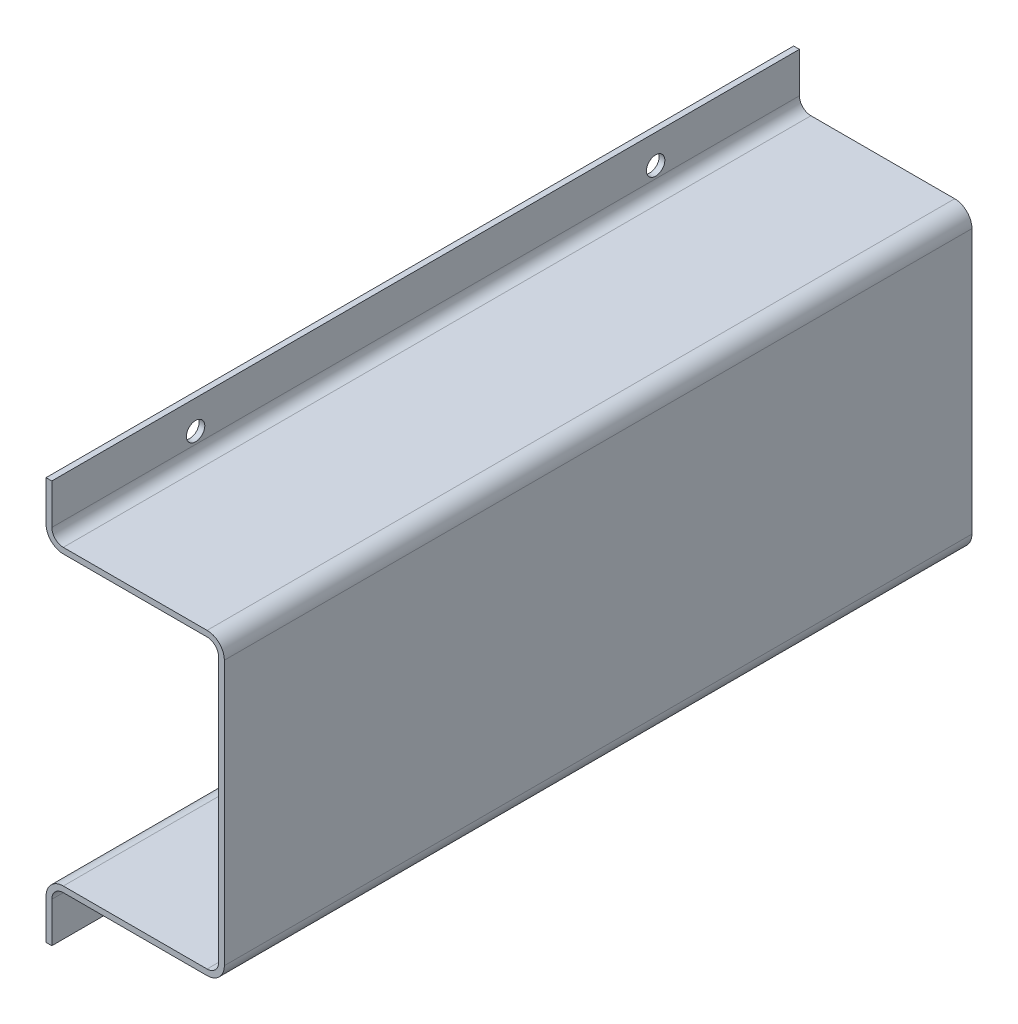
ISO-10303-21;
HEADER;
FILE_DESCRIPTION(('STEP AP214'),'2;1');
FILE_NAME('part.step','',(''),(''),'','','');
FILE_SCHEMA(('AUTOMOTIVE_DESIGN { 1 0 10303 214 1 1 1 1 }'));
ENDSEC;
DATA;
#1=APPLICATION_CONTEXT('core data for automotive mechanical design processes');
#2=APPLICATION_PROTOCOL_DEFINITION('international standard','automotive_design',2000,#1);
#3=PRODUCT_CONTEXT('',#1,'mechanical');
#4=PRODUCT('Part','Part','',(#3));
#5=PRODUCT_RELATED_PRODUCT_CATEGORY('part','',(#4));
#6=PRODUCT_DEFINITION_FORMATION('','',#4);
#7=PRODUCT_DEFINITION_CONTEXT('part definition',#1,'design');
#8=PRODUCT_DEFINITION('design','',#6,#7);
#9=PRODUCT_DEFINITION_SHAPE('','',#8);
#10=(LENGTH_UNIT() NAMED_UNIT(*) SI_UNIT(.MILLI.,.METRE.));
#11=(NAMED_UNIT(*) PLANE_ANGLE_UNIT() SI_UNIT($,.RADIAN.));
#12=(NAMED_UNIT(*) SI_UNIT($,.STERADIAN.) SOLID_ANGLE_UNIT());
#13=UNCERTAINTY_MEASURE_WITH_UNIT(LENGTH_MEASURE(1.E-05),#10,'distance_accuracy_value','');
#14=(GEOMETRIC_REPRESENTATION_CONTEXT(3) GLOBAL_UNCERTAINTY_ASSIGNED_CONTEXT((#13)) GLOBAL_UNIT_ASSIGNED_CONTEXT((#10,
#11,#12)) REPRESENTATION_CONTEXT('',''));
#15=CARTESIAN_POINT('',(0.,0.,0.));
#16=DIRECTION('',(0.,0.,1.));
#17=DIRECTION('',(1.,0.,0.));
#18=AXIS2_PLACEMENT_3D('',#15,#16,#17);
#19=CARTESIAN_POINT('',(0.,35.,130.));
#20=DIRECTION('',(0.,-1.,0.));
#21=DIRECTION('',(0.,0.,-1.));
#22=AXIS2_PLACEMENT_3D('',#19,#20,#21);
#23=PLANE('',#22);
#24=DIRECTION('',(-1.,0.,0.));
#25=VECTOR('',#24,1.);
#26=CARTESIAN_POINT('',(0.,35.,0.));
#27=LINE('',#26,#25);
#28=CARTESIAN_POINT('',(0.999999999999999,35.,0.));
#29=VERTEX_POINT('',#28);
#30=CARTESIAN_POINT('',(0.,35.,0.));
#31=VERTEX_POINT('',#30);
#32=EDGE_CURVE('E147',#29,#31,#27,.T.);
#33=ORIENTED_EDGE('',*,*,#32,.T.);
#34=DIRECTION('',(0.,0.,-1.));
#35=VECTOR('',#34,1.);
#36=CARTESIAN_POINT('',(0.,35.,130.));
#37=LINE('',#36,#35);
#38=CARTESIAN_POINT('',(0.,35.,130.));
#39=VERTEX_POINT('',#38);
#40=EDGE_CURVE('E11',#39,#31,#37,.T.);
#41=ORIENTED_EDGE('',*,*,#40,.F.);
#42=DIRECTION('',(-1.,0.,0.));
#43=VECTOR('',#42,1.);
#44=CARTESIAN_POINT('',(0.,35.,130.));
#45=LINE('',#44,#43);
#46=CARTESIAN_POINT('',(0.999999999999999,35.,130.));
#47=VERTEX_POINT('',#46);
#48=EDGE_CURVE('E169',#47,#39,#45,.T.);
#49=ORIENTED_EDGE('',*,*,#48,.F.);
#50=DIRECTION('',(0.,0.,-1.));
#51=VECTOR('',#50,1.);
#52=CARTESIAN_POINT('',(0.999999999999999,35.,130.));
#53=LINE('',#52,#51);
#54=EDGE_CURVE('E143',#47,#29,#53,.T.);
#55=ORIENTED_EDGE('',*,*,#54,.T.);
#56=EDGE_LOOP('',(#33,#41,#49,#55));
#57=FACE_BOUND('',#56,.T.);
#58=ADVANCED_FACE('F34',(#57),#23,.F.);
#59=CARTESIAN_POINT('',(0.,35.,130.));
#60=DIRECTION('',(1.,0.,0.));
#61=DIRECTION('',(0.,1.,0.));
#62=AXIS2_PLACEMENT_3D('',#59,#60,#61);
#63=PLANE('',#62);
#64=CARTESIAN_POINT('',(0.,30.,25.));
#65=DIRECTION('',(1.,0.,0.));
#66=DIRECTION('',(0.,1.,0.));
#67=AXIS2_PLACEMENT_3D('',#64,#65,#66);
#68=CIRCLE('',#67,1.59999999999999);
#69=CARTESIAN_POINT('',(0.,31.6,25.));
#70=VERTEX_POINT('',#69);
#71=EDGE_CURVE('E553',#70,#70,#68,.T.);
#72=ORIENTED_EDGE('',*,*,#71,.T.);
#73=EDGE_LOOP('',(#72));
#74=FACE_BOUND('',#73,.T.);
#75=CARTESIAN_POINT('',(0.,30.,105.));
#76=DIRECTION('',(1.,0.,0.));
#77=DIRECTION('',(0.,1.,0.));
#78=AXIS2_PLACEMENT_3D('',#75,#76,#77);
#79=CIRCLE('',#78,1.59999999999999);
#80=CARTESIAN_POINT('',(0.,31.6,105.));
#81=VERTEX_POINT('',#80);
#82=EDGE_CURVE('E151',#81,#81,#79,.T.);
#83=ORIENTED_EDGE('',*,*,#82,.T.);
#84=EDGE_LOOP('',(#83));
#85=FACE_BOUND('',#84,.T.);
#86=DIRECTION('',(0.,-1.,0.));
#87=VECTOR('',#86,1.);
#88=CARTESIAN_POINT('',(0.,35.,0.));
#89=LINE('',#88,#87);
#90=CARTESIAN_POINT('',(0.,28.,0.));
#91=VERTEX_POINT('',#90);
#92=EDGE_CURVE('E150',#31,#91,#89,.T.);
#93=ORIENTED_EDGE('',*,*,#92,.T.);
#94=DIRECTION('',(0.,0.,-1.));
#95=VECTOR('',#94,1.);
#96=CARTESIAN_POINT('',(0.,28.,130.));
#97=LINE('',#96,#95);
#98=CARTESIAN_POINT('',(0.,28.,130.));
#99=VERTEX_POINT('',#98);
#100=EDGE_CURVE('E43',#99,#91,#97,.T.);
#101=ORIENTED_EDGE('',*,*,#100,.F.);
#102=DIRECTION('',(0.,-1.,0.));
#103=VECTOR('',#102,1.);
#104=CARTESIAN_POINT('',(0.,35.,130.));
#105=LINE('',#104,#103);
#106=EDGE_CURVE('E101',#39,#99,#105,.T.);
#107=ORIENTED_EDGE('',*,*,#106,.F.);
#108=ORIENTED_EDGE('',*,*,#40,.T.);
#109=EDGE_LOOP('',(#93,#101,#107,#108));
#110=FACE_BOUND('',#109,.T.);
#111=ADVANCED_FACE('F249',(#74,#85,#110),#63,.F.);
#112=CARTESIAN_POINT('',(3.,28.,130.));
#113=DIRECTION('',(0.,0.,-1.));
#114=DIRECTION('',(-1.,0.,0.));
#115=AXIS2_PLACEMENT_3D('',#112,#113,#114);
#116=CYLINDRICAL_SURFACE('',#115,3.);
#117=CARTESIAN_POINT('',(3.,28.,0.));
#118=DIRECTION('',(0.,0.,1.));
#119=DIRECTION('',(1.,0.,0.));
#120=AXIS2_PLACEMENT_3D('',#117,#118,#119);
#121=CIRCLE('',#120,3.);
#122=CARTESIAN_POINT('',(3.,25.,0.));
#123=VERTEX_POINT('',#122);
#124=EDGE_CURVE('E153',#91,#123,#121,.T.);
#125=ORIENTED_EDGE('',*,*,#124,.T.);
#126=DIRECTION('',(0.,0.,-1.));
#127=VECTOR('',#126,1.);
#128=CARTESIAN_POINT('',(3.,25.,130.));
#129=LINE('',#128,#127);
#130=CARTESIAN_POINT('',(3.,25.,130.));
#131=VERTEX_POINT('',#130);
#132=EDGE_CURVE('E182',#131,#123,#129,.T.);
#133=ORIENTED_EDGE('',*,*,#132,.F.);
#134=CARTESIAN_POINT('',(3.,28.,130.));
#135=DIRECTION('',(0.,0.,1.));
#136=DIRECTION('',(1.,0.,0.));
#137=AXIS2_PLACEMENT_3D('',#134,#135,#136);
#138=CIRCLE('',#137,3.);
#139=EDGE_CURVE('E191',#99,#131,#138,.T.);
#140=ORIENTED_EDGE('',*,*,#139,.F.);
#141=ORIENTED_EDGE('',*,*,#100,.T.);
#142=EDGE_LOOP('',(#125,#133,#140,#141));
#143=FACE_BOUND('',#142,.T.);
#144=ADVANCED_FACE('F189',(#143),#116,.T.);
#145=CARTESIAN_POINT('',(3.,25.,130.));
#146=DIRECTION('',(0.,1.,0.));
#147=DIRECTION('',(0.,0.,1.));
#148=AXIS2_PLACEMENT_3D('',#145,#146,#147);
#149=PLANE('',#148);
#150=DIRECTION('',(1.,0.,0.));
#151=VECTOR('',#150,1.);
#152=CARTESIAN_POINT('',(3.,25.,0.));
#153=LINE('',#152,#151);
#154=CARTESIAN_POINT('',(28.,25.,0.));
#155=VERTEX_POINT('',#154);
#156=EDGE_CURVE('E155',#123,#155,#153,.T.);
#157=ORIENTED_EDGE('',*,*,#156,.T.);
#158=DIRECTION('',(0.,0.,-1.));
#159=VECTOR('',#158,1.);
#160=CARTESIAN_POINT('',(28.,25.,130.));
#161=LINE('',#160,#159);
#162=CARTESIAN_POINT('',(28.,25.,130.));
#163=VERTEX_POINT('',#162);
#164=EDGE_CURVE('E179',#163,#155,#161,.T.);
#165=ORIENTED_EDGE('',*,*,#164,.F.);
#166=DIRECTION('',(1.,0.,0.));
#167=VECTOR('',#166,1.);
#168=CARTESIAN_POINT('',(3.,25.,130.));
#169=LINE('',#168,#167);
#170=EDGE_CURVE('E210',#131,#163,#169,.T.);
#171=ORIENTED_EDGE('',*,*,#170,.F.);
#172=ORIENTED_EDGE('',*,*,#132,.T.);
#173=EDGE_LOOP('',(#157,#165,#171,#172));
#174=FACE_BOUND('',#173,.T.);
#175=ADVANCED_FACE('F200',(#174),#149,.F.);
#176=CARTESIAN_POINT('',(28.,23.,130.));
#177=DIRECTION('',(0.,0.,-1.));
#178=DIRECTION('',(-1.,0.,0.));
#179=AXIS2_PLACEMENT_3D('',#176,#177,#178);
#180=CYLINDRICAL_SURFACE('',#179,2.00000000000001);
#181=CARTESIAN_POINT('',(28.,23.,0.));
#182=DIRECTION('',(0.,0.,-1.));
#183=DIRECTION('',(-1.,0.,0.));
#184=AXIS2_PLACEMENT_3D('',#181,#182,#183);
#185=CIRCLE('',#184,2.00000000000001);
#186=CARTESIAN_POINT('',(30.,23.,0.));
#187=VERTEX_POINT('',#186);
#188=EDGE_CURVE('E157',#155,#187,#185,.T.);
#189=ORIENTED_EDGE('',*,*,#188,.T.);
#190=DIRECTION('',(0.,0.,-1.));
#191=VECTOR('',#190,1.);
#192=CARTESIAN_POINT('',(30.,23.,130.));
#193=LINE('',#192,#191);
#194=CARTESIAN_POINT('',(30.,23.,130.));
#195=VERTEX_POINT('',#194);
#196=EDGE_CURVE('E176',#195,#187,#193,.T.);
#197=ORIENTED_EDGE('',*,*,#196,.F.);
#198=CARTESIAN_POINT('',(28.,23.,130.));
#199=DIRECTION('',(0.,0.,-1.));
#200=DIRECTION('',(-1.,0.,0.));
#201=AXIS2_PLACEMENT_3D('',#198,#199,#200);
#202=CIRCLE('',#201,2.00000000000001);
#203=EDGE_CURVE('E206',#163,#195,#202,.T.);
#204=ORIENTED_EDGE('',*,*,#203,.F.);
#205=ORIENTED_EDGE('',*,*,#164,.T.);
#206=EDGE_LOOP('',(#189,#197,#204,#205));
#207=FACE_BOUND('',#206,.T.);
#208=ADVANCED_FACE('F204',(#207),#180,.F.);
#209=CARTESIAN_POINT('',(30.,23.,130.));
#210=DIRECTION('',(1.,0.,0.));
#211=DIRECTION('',(0.,1.,0.));
#212=AXIS2_PLACEMENT_3D('',#209,#210,#211);
#213=PLANE('',#212);
#214=DIRECTION('',(0.,-1.,0.));
#215=VECTOR('',#214,1.);
#216=CARTESIAN_POINT('',(30.,23.,0.));
#217=LINE('',#216,#215);
#218=CARTESIAN_POINT('',(30.,-23.,0.));
#219=VERTEX_POINT('',#218);
#220=EDGE_CURVE('E159',#187,#219,#217,.T.);
#221=ORIENTED_EDGE('',*,*,#220,.T.);
#222=DIRECTION('',(0.,0.,-1.));
#223=VECTOR('',#222,1.);
#224=CARTESIAN_POINT('',(30.,-23.,130.));
#225=LINE('',#224,#223);
#226=CARTESIAN_POINT('',(30.,-23.,130.));
#227=VERTEX_POINT('',#226);
#228=EDGE_CURVE('E533',#227,#219,#225,.T.);
#229=ORIENTED_EDGE('',*,*,#228,.F.);
#230=DIRECTION('',(0.,-1.,0.));
#231=VECTOR('',#230,1.);
#232=CARTESIAN_POINT('',(30.,23.,130.));
#233=LINE('',#232,#231);
#234=EDGE_CURVE('E209',#195,#227,#233,.T.);
#235=ORIENTED_EDGE('',*,*,#234,.F.);
#236=ORIENTED_EDGE('',*,*,#196,.T.);
#237=EDGE_LOOP('',(#221,#229,#235,#236));
#238=FACE_BOUND('',#237,.T.);
#239=ADVANCED_FACE('F265',(#238),#213,.F.);
#240=CARTESIAN_POINT('',(31.,23.,130.));
#241=DIRECTION('',(-1.,0.,0.));
#242=DIRECTION('',(0.,0.,1.));
#243=AXIS2_PLACEMENT_3D('',#240,#241,#242);
#244=PLANE('',#243);
#245=DIRECTION('',(0.,1.,0.));
#246=VECTOR('',#245,1.);
#247=CARTESIAN_POINT('',(31.,23.,0.));
#248=LINE('',#247,#246);
#249=CARTESIAN_POINT('',(31.,-23.,0.));
#250=VERTEX_POINT('',#249);
#251=CARTESIAN_POINT('',(31.,23.,0.));
#252=VERTEX_POINT('',#251);
#253=EDGE_CURVE('E162',#250,#252,#248,.T.);
#254=ORIENTED_EDGE('',*,*,#253,.T.);
#255=DIRECTION('',(0.,0.,-1.));
#256=VECTOR('',#255,1.);
#257=CARTESIAN_POINT('',(31.,23.,130.));
#258=LINE('',#257,#256);
#259=CARTESIAN_POINT('',(31.,23.,130.));
#260=VERTEX_POINT('',#259);
#261=EDGE_CURVE('E173',#260,#252,#258,.T.);
#262=ORIENTED_EDGE('',*,*,#261,.F.);
#263=DIRECTION('',(0.,1.,0.));
#264=VECTOR('',#263,1.);
#265=CARTESIAN_POINT('',(31.,23.,130.));
#266=LINE('',#265,#264);
#267=CARTESIAN_POINT('',(31.,-23.,130.));
#268=VERTEX_POINT('',#267);
#269=EDGE_CURVE('E212',#268,#260,#266,.T.);
#270=ORIENTED_EDGE('',*,*,#269,.F.);
#271=DIRECTION('',(0.,0.,-1.));
#272=VECTOR('',#271,1.);
#273=CARTESIAN_POINT('',(31.,-23.,130.));
#274=LINE('',#273,#272);
#275=EDGE_CURVE('E536',#268,#250,#274,.T.);
#276=ORIENTED_EDGE('',*,*,#275,.T.);
#277=EDGE_LOOP('',(#254,#262,#270,#276));
#278=FACE_BOUND('',#277,.T.);
#279=ADVANCED_FACE('F227',(#278),#244,.F.);
#280=CARTESIAN_POINT('',(28.,23.,130.));
#281=DIRECTION('',(0.,0.,-1.));
#282=DIRECTION('',(-1.,0.,0.));
#283=AXIS2_PLACEMENT_3D('',#280,#281,#282);
#284=CYLINDRICAL_SURFACE('',#283,3.);
#285=CARTESIAN_POINT('',(28.,23.,0.));
#286=DIRECTION('',(0.,0.,1.));
#287=DIRECTION('',(-1.,0.,0.));
#288=AXIS2_PLACEMENT_3D('',#285,#286,#287);
#289=CIRCLE('',#288,3.);
#290=CARTESIAN_POINT('',(28.,26.,0.));
#291=VERTEX_POINT('',#290);
#292=EDGE_CURVE('E164',#252,#291,#289,.T.);
#293=ORIENTED_EDGE('',*,*,#292,.T.);
#294=DIRECTION('',(0.,0.,-1.));
#295=VECTOR('',#294,1.);
#296=CARTESIAN_POINT('',(28.,26.,130.));
#297=LINE('',#296,#295);
#298=CARTESIAN_POINT('',(28.,26.,130.));
#299=VERTEX_POINT('',#298);
#300=EDGE_CURVE('E138',#299,#291,#297,.T.);
#301=ORIENTED_EDGE('',*,*,#300,.F.);
#302=CARTESIAN_POINT('',(28.,23.,130.));
#303=DIRECTION('',(0.,0.,1.));
#304=DIRECTION('',(-1.,0.,0.));
#305=AXIS2_PLACEMENT_3D('',#302,#303,#304);
#306=CIRCLE('',#305,3.);
#307=EDGE_CURVE('E129',#260,#299,#306,.T.);
#308=ORIENTED_EDGE('',*,*,#307,.F.);
#309=ORIENTED_EDGE('',*,*,#261,.T.);
#310=EDGE_LOOP('',(#293,#301,#308,#309));
#311=FACE_BOUND('',#310,.T.);
#312=ADVANCED_FACE('F231',(#311),#284,.T.);
#313=CARTESIAN_POINT('',(3.,26.,130.));
#314=DIRECTION('',(0.,-1.,0.));
#315=DIRECTION('',(0.,0.,-1.));
#316=AXIS2_PLACEMENT_3D('',#313,#314,#315);
#317=PLANE('',#316);
#318=DIRECTION('',(-1.,0.,0.));
#319=VECTOR('',#318,1.);
#320=CARTESIAN_POINT('',(3.,26.,0.));
#321=LINE('',#320,#319);
#322=CARTESIAN_POINT('',(3.,26.,0.));
#323=VERTEX_POINT('',#322);
#324=EDGE_CURVE('E137',#291,#323,#321,.T.);
#325=ORIENTED_EDGE('',*,*,#324,.T.);
#326=DIRECTION('',(0.,0.,-1.));
#327=VECTOR('',#326,1.);
#328=CARTESIAN_POINT('',(3.,26.,130.));
#329=LINE('',#328,#327);
#330=CARTESIAN_POINT('',(3.,26.,130.));
#331=VERTEX_POINT('',#330);
#332=EDGE_CURVE('E134',#331,#323,#329,.T.);
#333=ORIENTED_EDGE('',*,*,#332,.F.);
#334=DIRECTION('',(-1.,0.,0.));
#335=VECTOR('',#334,1.);
#336=CARTESIAN_POINT('',(3.,26.,130.));
#337=LINE('',#336,#335);
#338=EDGE_CURVE('E123',#299,#331,#337,.T.);
#339=ORIENTED_EDGE('',*,*,#338,.F.);
#340=ORIENTED_EDGE('',*,*,#300,.T.);
#341=EDGE_LOOP('',(#325,#333,#339,#340));
#342=FACE_BOUND('',#341,.T.);
#343=ADVANCED_FACE('F135',(#342),#317,.F.);
#344=CARTESIAN_POINT('',(3.,28.,130.));
#345=DIRECTION('',(0.,0.,-1.));
#346=DIRECTION('',(-1.,0.,0.));
#347=AXIS2_PLACEMENT_3D('',#344,#345,#346);
#348=CYLINDRICAL_SURFACE('',#347,2.);
#349=CARTESIAN_POINT('',(3.,28.,0.));
#350=DIRECTION('',(0.,0.,-1.));
#351=DIRECTION('',(1.,0.,0.));
#352=AXIS2_PLACEMENT_3D('',#349,#350,#351);
#353=CIRCLE('',#352,2.);
#354=CARTESIAN_POINT('',(1.,28.,0.));
#355=VERTEX_POINT('',#354);
#356=EDGE_CURVE('E87',#323,#355,#353,.T.);
#357=ORIENTED_EDGE('',*,*,#356,.T.);
#358=DIRECTION('',(0.,0.,-1.));
#359=VECTOR('',#358,1.);
#360=CARTESIAN_POINT('',(1.,28.,130.));
#361=LINE('',#360,#359);
#362=CARTESIAN_POINT('',(1.,28.,130.));
#363=VERTEX_POINT('',#362);
#364=EDGE_CURVE('E139',#363,#355,#361,.T.);
#365=ORIENTED_EDGE('',*,*,#364,.F.);
#366=CARTESIAN_POINT('',(3.,28.,130.));
#367=DIRECTION('',(0.,0.,-1.));
#368=DIRECTION('',(1.,0.,0.));
#369=AXIS2_PLACEMENT_3D('',#366,#367,#368);
#370=CIRCLE('',#369,2.);
#371=EDGE_CURVE('E127',#331,#363,#370,.T.);
#372=ORIENTED_EDGE('',*,*,#371,.F.);
#373=ORIENTED_EDGE('',*,*,#332,.T.);
#374=EDGE_LOOP('',(#357,#365,#372,#373));
#375=FACE_BOUND('',#374,.T.);
#376=ADVANCED_FACE('F141',(#375),#348,.F.);
#377=CARTESIAN_POINT('',(0.999999999999999,35.,130.));
#378=DIRECTION('',(-1.,0.,0.));
#379=DIRECTION('',(0.,-1.,0.));
#380=AXIS2_PLACEMENT_3D('',#377,#378,#379);
#381=PLANE('',#380);
#382=CARTESIAN_POINT('',(1.00000000000002,30.,25.));
#383=DIRECTION('',(1.,0.,0.));
#384=DIRECTION('',(0.,0.,-1.));
#385=AXIS2_PLACEMENT_3D('',#382,#383,#384);
#386=CIRCLE('',#385,1.59999999999999);
#387=CARTESIAN_POINT('',(1.00000000000002,30.,23.4));
#388=VERTEX_POINT('',#387);
#389=EDGE_CURVE('E550',#388,#388,#386,.T.);
#390=ORIENTED_EDGE('',*,*,#389,.F.);
#391=EDGE_LOOP('',(#390));
#392=FACE_BOUND('',#391,.T.);
#393=CARTESIAN_POINT('',(1.00000000000002,30.,105.));
#394=DIRECTION('',(1.,0.,0.));
#395=DIRECTION('',(0.,0.,-1.));
#396=AXIS2_PLACEMENT_3D('',#393,#394,#395);
#397=CIRCLE('',#396,1.59999999999999);
#398=CARTESIAN_POINT('',(1.00000000000002,30.,103.4));
#399=VERTEX_POINT('',#398);
#400=EDGE_CURVE('E555',#399,#399,#397,.T.);
#401=ORIENTED_EDGE('',*,*,#400,.F.);
#402=EDGE_LOOP('',(#401));
#403=FACE_BOUND('',#402,.T.);
#404=DIRECTION('',(0.,1.,0.));
#405=VECTOR('',#404,1.);
#406=CARTESIAN_POINT('',(0.999999999999999,35.,0.));
#407=LINE('',#406,#405);
#408=EDGE_CURVE('E93',#355,#29,#407,.T.);
#409=ORIENTED_EDGE('',*,*,#408,.T.);
#410=ORIENTED_EDGE('',*,*,#54,.F.);
#411=DIRECTION('',(0.,1.,0.));
#412=VECTOR('',#411,1.);
#413=CARTESIAN_POINT('',(0.999999999999999,35.,130.));
#414=LINE('',#413,#412);
#415=EDGE_CURVE('E51',#363,#47,#414,.T.);
#416=ORIENTED_EDGE('',*,*,#415,.F.);
#417=ORIENTED_EDGE('',*,*,#364,.T.);
#418=EDGE_LOOP('',(#409,#410,#416,#417));
#419=FACE_BOUND('',#418,.T.);
#420=ADVANCED_FACE('F235',(#392,#403,#419),#381,.F.);
#421=CARTESIAN_POINT('',(3.,28.,130.));
#422=DIRECTION('',(0.,0.,1.));
#423=DIRECTION('',(1.,0.,0.));
#424=AXIS2_PLACEMENT_3D('',#421,#422,#423);
#425=PLANE('',#424);
#426=ORIENTED_EDGE('',*,*,#48,.T.);
#427=ORIENTED_EDGE('',*,*,#106,.T.);
#428=ORIENTED_EDGE('',*,*,#139,.T.);
#429=ORIENTED_EDGE('',*,*,#170,.T.);
#430=ORIENTED_EDGE('',*,*,#203,.T.);
#431=ORIENTED_EDGE('',*,*,#234,.T.);
#432=CARTESIAN_POINT('',(28.,-23.,130.));
#433=DIRECTION('',(0.,0.,1.));
#434=DIRECTION('',(-1.,0.,0.));
#435=AXIS2_PLACEMENT_3D('',#432,#433,#434);
#436=CIRCLE('',#435,2.00000000000001);
#437=CARTESIAN_POINT('',(28.,-25.,130.));
#438=VERTEX_POINT('',#437);
#439=EDGE_CURVE('E484',#438,#227,#436,.T.);
#440=ORIENTED_EDGE('',*,*,#439,.F.);
#441=DIRECTION('',(1.,0.,0.));
#442=VECTOR('',#441,1.);
#443=CARTESIAN_POINT('',(3.,-25.,130.));
#444=LINE('',#443,#442);
#445=CARTESIAN_POINT('',(3.,-25.,130.));
#446=VERTEX_POINT('',#445);
#447=EDGE_CURVE('E487',#446,#438,#444,.T.);
#448=ORIENTED_EDGE('',*,*,#447,.F.);
#449=CARTESIAN_POINT('',(3.,-28.,130.));
#450=DIRECTION('',(0.,0.,-1.));
#451=DIRECTION('',(1.,0.,0.));
#452=AXIS2_PLACEMENT_3D('',#449,#450,#451);
#453=CIRCLE('',#452,3.);
#454=CARTESIAN_POINT('',(0.,-28.,130.));
#455=VERTEX_POINT('',#454);
#456=EDGE_CURVE('E490',#455,#446,#453,.T.);
#457=ORIENTED_EDGE('',*,*,#456,.F.);
#458=DIRECTION('',(0.,1.,0.));
#459=VECTOR('',#458,1.);
#460=CARTESIAN_POINT('',(0.,-35.,130.));
#461=LINE('',#460,#459);
#462=CARTESIAN_POINT('',(0.,-35.,130.));
#463=VERTEX_POINT('',#462);
#464=EDGE_CURVE('E493',#463,#455,#461,.T.);
#465=ORIENTED_EDGE('',*,*,#464,.F.);
#466=DIRECTION('',(-1.,0.,0.));
#467=VECTOR('',#466,1.);
#468=CARTESIAN_POINT('',(0.,-35.,130.));
#469=LINE('',#468,#467);
#470=CARTESIAN_POINT('',(0.999999999999999,-35.,130.));
#471=VERTEX_POINT('',#470);
#472=EDGE_CURVE('E470',#471,#463,#469,.T.);
#473=ORIENTED_EDGE('',*,*,#472,.F.);
#474=DIRECTION('',(0.,-1.,0.));
#475=VECTOR('',#474,1.);
#476=CARTESIAN_POINT('',(0.999999999999999,-35.,130.));
#477=LINE('',#476,#475);
#478=CARTESIAN_POINT('',(1.,-28.,130.));
#479=VERTEX_POINT('',#478);
#480=EDGE_CURVE('E473',#479,#471,#477,.T.);
#481=ORIENTED_EDGE('',*,*,#480,.F.);
#482=CARTESIAN_POINT('',(3.,-28.,130.));
#483=DIRECTION('',(0.,0.,1.));
#484=DIRECTION('',(1.,0.,0.));
#485=AXIS2_PLACEMENT_3D('',#482,#483,#484);
#486=CIRCLE('',#485,2.);
#487=CARTESIAN_POINT('',(3.,-26.,130.));
#488=VERTEX_POINT('',#487);
#489=EDGE_CURVE('E477',#488,#479,#486,.T.);
#490=ORIENTED_EDGE('',*,*,#489,.F.);
#491=DIRECTION('',(-1.,0.,0.));
#492=VECTOR('',#491,1.);
#493=CARTESIAN_POINT('',(3.,-26.,130.));
#494=LINE('',#493,#492);
#495=CARTESIAN_POINT('',(28.,-26.,130.));
#496=VERTEX_POINT('',#495);
#497=EDGE_CURVE('E480',#496,#488,#494,.T.);
#498=ORIENTED_EDGE('',*,*,#497,.F.);
#499=CARTESIAN_POINT('',(28.,-23.,130.));
#500=DIRECTION('',(0.,0.,-1.));
#501=DIRECTION('',(-1.,0.,0.));
#502=AXIS2_PLACEMENT_3D('',#499,#500,#501);
#503=CIRCLE('',#502,3.);
#504=EDGE_CURVE('E223',#268,#496,#503,.T.);
#505=ORIENTED_EDGE('',*,*,#504,.F.);
#506=ORIENTED_EDGE('',*,*,#269,.T.);
#507=ORIENTED_EDGE('',*,*,#307,.T.);
#508=ORIENTED_EDGE('',*,*,#338,.T.);
#509=ORIENTED_EDGE('',*,*,#371,.T.);
#510=ORIENTED_EDGE('',*,*,#415,.T.);
#511=EDGE_LOOP('',(#426,#427,#428,#429,#430,#431,#440,#448,#457,#465,#473,#481,#490,#498,#505,
#506,#507,#508,#509,#510));
#512=FACE_BOUND('',#511,.T.);
#513=ADVANCED_FACE('F125',(#512),#425,.T.);
#514=CARTESIAN_POINT('',(3.,28.,0.));
#515=DIRECTION('',(0.,0.,1.));
#516=DIRECTION('',(1.,0.,0.));
#517=AXIS2_PLACEMENT_3D('',#514,#515,#516);
#518=PLANE('',#517);
#519=ORIENTED_EDGE('',*,*,#32,.F.);
#520=ORIENTED_EDGE('',*,*,#408,.F.);
#521=ORIENTED_EDGE('',*,*,#356,.F.);
#522=ORIENTED_EDGE('',*,*,#324,.F.);
#523=ORIENTED_EDGE('',*,*,#292,.F.);
#524=ORIENTED_EDGE('',*,*,#253,.F.);
#525=CARTESIAN_POINT('',(28.,-23.,0.));
#526=DIRECTION('',(0.,0.,-1.));
#527=DIRECTION('',(-1.,0.,0.));
#528=AXIS2_PLACEMENT_3D('',#525,#526,#527);
#529=CIRCLE('',#528,3.);
#530=CARTESIAN_POINT('',(28.,-26.,0.));
#531=VERTEX_POINT('',#530);
#532=EDGE_CURVE('E508',#250,#531,#529,.T.);
#533=ORIENTED_EDGE('',*,*,#532,.T.);
#534=DIRECTION('',(-1.,0.,0.));
#535=VECTOR('',#534,1.);
#536=CARTESIAN_POINT('',(3.,-26.,0.));
#537=LINE('',#536,#535);
#538=CARTESIAN_POINT('',(3.,-26.,0.));
#539=VERTEX_POINT('',#538);
#540=EDGE_CURVE('E505',#531,#539,#537,.T.);
#541=ORIENTED_EDGE('',*,*,#540,.T.);
#542=CARTESIAN_POINT('',(3.,-28.,0.));
#543=DIRECTION('',(0.,0.,1.));
#544=DIRECTION('',(1.,0.,0.));
#545=AXIS2_PLACEMENT_3D('',#542,#543,#544);
#546=CIRCLE('',#545,2.);
#547=CARTESIAN_POINT('',(1.,-28.,0.));
#548=VERTEX_POINT('',#547);
#549=EDGE_CURVE('E502',#539,#548,#546,.T.);
#550=ORIENTED_EDGE('',*,*,#549,.T.);
#551=DIRECTION('',(0.,-1.,0.));
#552=VECTOR('',#551,1.);
#553=CARTESIAN_POINT('',(0.999999999999999,-35.,0.));
#554=LINE('',#553,#552);
#555=CARTESIAN_POINT('',(0.999999999999999,-35.,0.));
#556=VERTEX_POINT('',#555);
#557=EDGE_CURVE('E499',#548,#556,#554,.T.);
#558=ORIENTED_EDGE('',*,*,#557,.T.);
#559=DIRECTION('',(-1.,0.,0.));
#560=VECTOR('',#559,1.);
#561=CARTESIAN_POINT('',(0.,-35.,0.));
#562=LINE('',#561,#560);
#563=CARTESIAN_POINT('',(0.,-35.,0.));
#564=VERTEX_POINT('',#563);
#565=EDGE_CURVE('E469',#556,#564,#562,.T.);
#566=ORIENTED_EDGE('',*,*,#565,.T.);
#567=DIRECTION('',(0.,1.,0.));
#568=VECTOR('',#567,1.);
#569=CARTESIAN_POINT('',(0.,-35.,0.));
#570=LINE('',#569,#568);
#571=CARTESIAN_POINT('',(0.,-28.,0.));
#572=VERTEX_POINT('',#571);
#573=EDGE_CURVE('E474',#564,#572,#570,.T.);
#574=ORIENTED_EDGE('',*,*,#573,.T.);
#575=CARTESIAN_POINT('',(3.,-28.,0.));
#576=DIRECTION('',(0.,0.,-1.));
#577=DIRECTION('',(1.,0.,0.));
#578=AXIS2_PLACEMENT_3D('',#575,#576,#577);
#579=CIRCLE('',#578,3.);
#580=CARTESIAN_POINT('',(3.,-25.,0.));
#581=VERTEX_POINT('',#580);
#582=EDGE_CURVE('E517',#572,#581,#579,.T.);
#583=ORIENTED_EDGE('',*,*,#582,.T.);
#584=DIRECTION('',(1.,0.,0.));
#585=VECTOR('',#584,1.);
#586=CARTESIAN_POINT('',(3.,-25.,0.));
#587=LINE('',#586,#585);
#588=CARTESIAN_POINT('',(28.,-25.,0.));
#589=VERTEX_POINT('',#588);
#590=EDGE_CURVE('E514',#581,#589,#587,.T.);
#591=ORIENTED_EDGE('',*,*,#590,.T.);
#592=CARTESIAN_POINT('',(28.,-23.,0.));
#593=DIRECTION('',(0.,0.,1.));
#594=DIRECTION('',(-1.,0.,0.));
#595=AXIS2_PLACEMENT_3D('',#592,#593,#594);
#596=CIRCLE('',#595,2.00000000000001);
#597=EDGE_CURVE('E511',#589,#219,#596,.T.);
#598=ORIENTED_EDGE('',*,*,#597,.T.);
#599=ORIENTED_EDGE('',*,*,#220,.F.);
#600=ORIENTED_EDGE('',*,*,#188,.F.);
#601=ORIENTED_EDGE('',*,*,#156,.F.);
#602=ORIENTED_EDGE('',*,*,#124,.F.);
#603=ORIENTED_EDGE('',*,*,#92,.F.);
#604=EDGE_LOOP('',(#519,#520,#521,#522,#523,#524,#533,#541,#550,#558,#566,#574,#583,#591,#598,
#599,#600,#601,#602,#603));
#605=FACE_BOUND('',#604,.T.);
#606=ADVANCED_FACE('F195',(#605),#518,.F.);
#607=CARTESIAN_POINT('',(1.00000000000002,30.,105.));
#608=DIRECTION('',(1.,0.,0.));
#609=DIRECTION('',(0.,0.,-1.));
#610=AXIS2_PLACEMENT_3D('',#607,#608,#609);
#611=CYLINDRICAL_SURFACE('',#610,1.59999999999999);
#612=ORIENTED_EDGE('',*,*,#400,.T.);
#613=EDGE_LOOP('',(#612));
#614=FACE_BOUND('',#613,.T.);
#615=ORIENTED_EDGE('',*,*,#82,.F.);
#616=EDGE_LOOP('',(#615));
#617=FACE_BOUND('',#616,.T.);
#618=ADVANCED_FACE('F298',(#614,#617),#611,.F.);
#619=CARTESIAN_POINT('',(1.00000000000002,30.,25.));
#620=DIRECTION('',(1.,0.,0.));
#621=DIRECTION('',(0.,0.,-1.));
#622=AXIS2_PLACEMENT_3D('',#619,#620,#621);
#623=CYLINDRICAL_SURFACE('',#622,1.59999999999999);
#624=ORIENTED_EDGE('',*,*,#389,.T.);
#625=EDGE_LOOP('',(#624));
#626=FACE_BOUND('',#625,.T.);
#627=ORIENTED_EDGE('',*,*,#71,.F.);
#628=EDGE_LOOP('',(#627));
#629=FACE_BOUND('',#628,.T.);
#630=ADVANCED_FACE('F303',(#626,#629),#623,.F.);
#631=CARTESIAN_POINT('',(0.,-35.,130.));
#632=DIRECTION('',(0.,-1.,0.));
#633=DIRECTION('',(0.,0.,-1.));
#634=AXIS2_PLACEMENT_3D('',#631,#632,#633);
#635=PLANE('',#634);
#636=ORIENTED_EDGE('',*,*,#565,.F.);
#637=DIRECTION('',(0.,0.,-1.));
#638=VECTOR('',#637,1.);
#639=CARTESIAN_POINT('',(0.999999999999999,-35.,130.));
#640=LINE('',#639,#638);
#641=EDGE_CURVE('E547',#471,#556,#640,.T.);
#642=ORIENTED_EDGE('',*,*,#641,.F.);
#643=ORIENTED_EDGE('',*,*,#472,.T.);
#644=DIRECTION('',(0.,0.,-1.));
#645=VECTOR('',#644,1.);
#646=CARTESIAN_POINT('',(0.,-35.,130.));
#647=LINE('',#646,#645);
#648=EDGE_CURVE('E496',#463,#564,#647,.T.);
#649=ORIENTED_EDGE('',*,*,#648,.T.);
#650=EDGE_LOOP('',(#636,#642,#643,#649));
#651=FACE_BOUND('',#650,.T.);
#652=ADVANCED_FACE('F315',(#651),#635,.T.);
#653=CARTESIAN_POINT('',(0.999999999999999,-35.,130.));
#654=DIRECTION('',(1.,0.,0.));
#655=DIRECTION('',(0.,1.,0.));
#656=AXIS2_PLACEMENT_3D('',#653,#654,#655);
#657=PLANE('',#656);
#658=CARTESIAN_POINT('',(1.00000000000002,-30.,25.));
#659=DIRECTION('',(1.,0.,0.));
#660=DIRECTION('',(0.,0.,-1.));
#661=AXIS2_PLACEMENT_3D('',#658,#659,#660);
#662=CIRCLE('',#661,1.59999999999999);
#663=CARTESIAN_POINT('',(1.00000000000002,-30.,23.4));
#664=VERTEX_POINT('',#663);
#665=EDGE_CURVE('E460',#664,#664,#662,.T.);
#666=ORIENTED_EDGE('',*,*,#665,.F.);
#667=EDGE_LOOP('',(#666));
#668=FACE_BOUND('',#667,.T.);
#669=CARTESIAN_POINT('',(1.00000000000002,-30.,105.));
#670=DIRECTION('',(1.,0.,0.));
#671=DIRECTION('',(0.,0.,-1.));
#672=AXIS2_PLACEMENT_3D('',#669,#670,#671);
#673=CIRCLE('',#672,1.59999999999999);
#674=CARTESIAN_POINT('',(1.00000000000002,-30.,103.4));
#675=VERTEX_POINT('',#674);
#676=EDGE_CURVE('E462',#675,#675,#673,.T.);
#677=ORIENTED_EDGE('',*,*,#676,.F.);
#678=EDGE_LOOP('',(#677));
#679=FACE_BOUND('',#678,.T.);
#680=ORIENTED_EDGE('',*,*,#557,.F.);
#681=DIRECTION('',(0.,0.,-1.));
#682=VECTOR('',#681,1.);
#683=CARTESIAN_POINT('',(1.,-28.,130.));
#684=LINE('',#683,#682);
#685=EDGE_CURVE('E544',#479,#548,#684,.T.);
#686=ORIENTED_EDGE('',*,*,#685,.F.);
#687=ORIENTED_EDGE('',*,*,#480,.T.);
#688=ORIENTED_EDGE('',*,*,#641,.T.);
#689=EDGE_LOOP('',(#680,#686,#687,#688));
#690=FACE_BOUND('',#689,.T.);
#691=ADVANCED_FACE('F351',(#668,#679,#690),#657,.T.);
#692=CARTESIAN_POINT('',(3.,-28.,130.));
#693=DIRECTION('',(0.,0.,-1.));
#694=DIRECTION('',(-1.,0.,0.));
#695=AXIS2_PLACEMENT_3D('',#692,#693,#694);
#696=CYLINDRICAL_SURFACE('',#695,2.);
#697=ORIENTED_EDGE('',*,*,#549,.F.);
#698=DIRECTION('',(0.,0.,-1.));
#699=VECTOR('',#698,1.);
#700=CARTESIAN_POINT('',(3.,-26.,130.));
#701=LINE('',#700,#699);
#702=EDGE_CURVE('E541',#488,#539,#701,.T.);
#703=ORIENTED_EDGE('',*,*,#702,.F.);
#704=ORIENTED_EDGE('',*,*,#489,.T.);
#705=ORIENTED_EDGE('',*,*,#685,.T.);
#706=EDGE_LOOP('',(#697,#703,#704,#705));
#707=FACE_BOUND('',#706,.T.);
#708=ADVANCED_FACE('F361',(#707),#696,.F.);
#709=CARTESIAN_POINT('',(3.,-26.,130.));
#710=DIRECTION('',(0.,-1.,0.));
#711=DIRECTION('',(0.,0.,-1.));
#712=AXIS2_PLACEMENT_3D('',#709,#710,#711);
#713=PLANE('',#712);
#714=ORIENTED_EDGE('',*,*,#540,.F.);
#715=DIRECTION('',(0.,0.,-1.));
#716=VECTOR('',#715,1.);
#717=CARTESIAN_POINT('',(28.,-26.,130.));
#718=LINE('',#717,#716);
#719=EDGE_CURVE('E538',#496,#531,#718,.T.);
#720=ORIENTED_EDGE('',*,*,#719,.F.);
#721=ORIENTED_EDGE('',*,*,#497,.T.);
#722=ORIENTED_EDGE('',*,*,#702,.T.);
#723=EDGE_LOOP('',(#714,#720,#721,#722));
#724=FACE_BOUND('',#723,.T.);
#725=ADVANCED_FACE('F371',(#724),#713,.T.);
#726=CARTESIAN_POINT('',(28.,-23.,130.));
#727=DIRECTION('',(0.,0.,-1.));
#728=DIRECTION('',(-1.,0.,0.));
#729=AXIS2_PLACEMENT_3D('',#726,#727,#728);
#730=CYLINDRICAL_SURFACE('',#729,3.);
#731=ORIENTED_EDGE('',*,*,#532,.F.);
#732=ORIENTED_EDGE('',*,*,#275,.F.);
#733=ORIENTED_EDGE('',*,*,#504,.T.);
#734=ORIENTED_EDGE('',*,*,#719,.T.);
#735=EDGE_LOOP('',(#731,#732,#733,#734));
#736=FACE_BOUND('',#735,.T.);
#737=ADVANCED_FACE('F381',(#736),#730,.T.);
#738=CARTESIAN_POINT('',(28.,-23.,130.));
#739=DIRECTION('',(0.,0.,-1.));
#740=DIRECTION('',(-1.,0.,0.));
#741=AXIS2_PLACEMENT_3D('',#738,#739,#740);
#742=CYLINDRICAL_SURFACE('',#741,2.00000000000001);
#743=ORIENTED_EDGE('',*,*,#597,.F.);
#744=DIRECTION('',(0.,0.,-1.));
#745=VECTOR('',#744,1.);
#746=CARTESIAN_POINT('',(28.,-25.,130.));
#747=LINE('',#746,#745);
#748=EDGE_CURVE('E530',#438,#589,#747,.T.);
#749=ORIENTED_EDGE('',*,*,#748,.F.);
#750=ORIENTED_EDGE('',*,*,#439,.T.);
#751=ORIENTED_EDGE('',*,*,#228,.T.);
#752=EDGE_LOOP('',(#743,#749,#750,#751));
#753=FACE_BOUND('',#752,.T.);
#754=ADVANCED_FACE('F391',(#753),#742,.F.);
#755=CARTESIAN_POINT('',(3.,-25.,130.));
#756=DIRECTION('',(0.,1.,0.));
#757=DIRECTION('',(0.,0.,1.));
#758=AXIS2_PLACEMENT_3D('',#755,#756,#757);
#759=PLANE('',#758);
#760=ORIENTED_EDGE('',*,*,#590,.F.);
#761=DIRECTION('',(0.,0.,-1.));
#762=VECTOR('',#761,1.);
#763=CARTESIAN_POINT('',(3.,-25.,130.));
#764=LINE('',#763,#762);
#765=EDGE_CURVE('E527',#446,#581,#764,.T.);
#766=ORIENTED_EDGE('',*,*,#765,.F.);
#767=ORIENTED_EDGE('',*,*,#447,.T.);
#768=ORIENTED_EDGE('',*,*,#748,.T.);
#769=EDGE_LOOP('',(#760,#766,#767,#768));
#770=FACE_BOUND('',#769,.T.);
#771=ADVANCED_FACE('F401',(#770),#759,.T.);
#772=CARTESIAN_POINT('',(3.,-28.,130.));
#773=DIRECTION('',(0.,0.,-1.));
#774=DIRECTION('',(-1.,0.,0.));
#775=AXIS2_PLACEMENT_3D('',#772,#773,#774);
#776=CYLINDRICAL_SURFACE('',#775,3.);
#777=ORIENTED_EDGE('',*,*,#582,.F.);
#778=DIRECTION('',(0.,0.,-1.));
#779=VECTOR('',#778,1.);
#780=CARTESIAN_POINT('',(0.,-28.,130.));
#781=LINE('',#780,#779);
#782=EDGE_CURVE('E524',#455,#572,#781,.T.);
#783=ORIENTED_EDGE('',*,*,#782,.F.);
#784=ORIENTED_EDGE('',*,*,#456,.T.);
#785=ORIENTED_EDGE('',*,*,#765,.T.);
#786=EDGE_LOOP('',(#777,#783,#784,#785));
#787=FACE_BOUND('',#786,.T.);
#788=ADVANCED_FACE('F411',(#787),#776,.T.);
#789=CARTESIAN_POINT('',(0.,-35.,130.));
#790=DIRECTION('',(-1.,0.,0.));
#791=DIRECTION('',(0.,-1.,0.));
#792=AXIS2_PLACEMENT_3D('',#789,#790,#791);
#793=PLANE('',#792);
#794=CARTESIAN_POINT('',(0.,-30.,25.));
#795=DIRECTION('',(-1.,0.,0.));
#796=DIRECTION('',(0.,-1.,0.));
#797=AXIS2_PLACEMENT_3D('',#794,#795,#796);
#798=CIRCLE('',#797,1.59999999999999);
#799=CARTESIAN_POINT('',(0.,-31.6,25.));
#800=VERTEX_POINT('',#799);
#801=EDGE_CURVE('E37',#800,#800,#798,.T.);
#802=ORIENTED_EDGE('',*,*,#801,.F.);
#803=EDGE_LOOP('',(#802));
#804=FACE_BOUND('',#803,.T.);
#805=CARTESIAN_POINT('',(0.,-30.,105.));
#806=DIRECTION('',(-1.,0.,0.));
#807=DIRECTION('',(0.,-1.,0.));
#808=AXIS2_PLACEMENT_3D('',#805,#806,#807);
#809=CIRCLE('',#808,1.59999999999999);
#810=CARTESIAN_POINT('',(0.,-31.6,105.));
#811=VERTEX_POINT('',#810);
#812=EDGE_CURVE('E466',#811,#811,#809,.T.);
#813=ORIENTED_EDGE('',*,*,#812,.F.);
#814=EDGE_LOOP('',(#813));
#815=FACE_BOUND('',#814,.T.);
#816=ORIENTED_EDGE('',*,*,#573,.F.);
#817=ORIENTED_EDGE('',*,*,#648,.F.);
#818=ORIENTED_EDGE('',*,*,#464,.T.);
#819=ORIENTED_EDGE('',*,*,#782,.T.);
#820=EDGE_LOOP('',(#816,#817,#818,#819));
#821=FACE_BOUND('',#820,.T.);
#822=ADVANCED_FACE('F421',(#804,#815,#821),#793,.T.);
#823=CARTESIAN_POINT('',(1.00000000000002,-30.,105.));
#824=DIRECTION('',(1.,0.,0.));
#825=DIRECTION('',(0.,0.,-1.));
#826=AXIS2_PLACEMENT_3D('',#823,#824,#825);
#827=CYLINDRICAL_SURFACE('',#826,1.59999999999999);
#828=ORIENTED_EDGE('',*,*,#812,.T.);
#829=EDGE_LOOP('',(#828));
#830=FACE_BOUND('',#829,.T.);
#831=ORIENTED_EDGE('',*,*,#676,.T.);
#832=EDGE_LOOP('',(#831));
#833=FACE_BOUND('',#832,.T.);
#834=ADVANCED_FACE('F431',(#830,#833),#827,.F.);
#835=CARTESIAN_POINT('',(1.00000000000002,-30.,25.));
#836=DIRECTION('',(1.,0.,0.));
#837=DIRECTION('',(0.,0.,-1.));
#838=AXIS2_PLACEMENT_3D('',#835,#836,#837);
#839=CYLINDRICAL_SURFACE('',#838,1.59999999999999);
#840=ORIENTED_EDGE('',*,*,#801,.T.);
#841=EDGE_LOOP('',(#840));
#842=FACE_BOUND('',#841,.T.);
#843=ORIENTED_EDGE('',*,*,#665,.T.);
#844=EDGE_LOOP('',(#843));
#845=FACE_BOUND('',#844,.T.);
#846=ADVANCED_FACE('F441',(#842,#845),#839,.F.);
#847=CLOSED_SHELL('',(#58,#111,#144,#175,#208,#239,#279,#312,#343,#376,#420,#513,#606,#618,#630,
#652,#691,#708,#725,#737,#754,#771,#788,#822,#834,#846));
#848=MANIFOLD_SOLID_BREP('B2',#847);
#849=ADVANCED_BREP_SHAPE_REPRESENTATION('',(#18,#848),#14);
#850=SHAPE_DEFINITION_REPRESENTATION(#9,#849);
ENDSEC;
END-ISO-10303-21;
